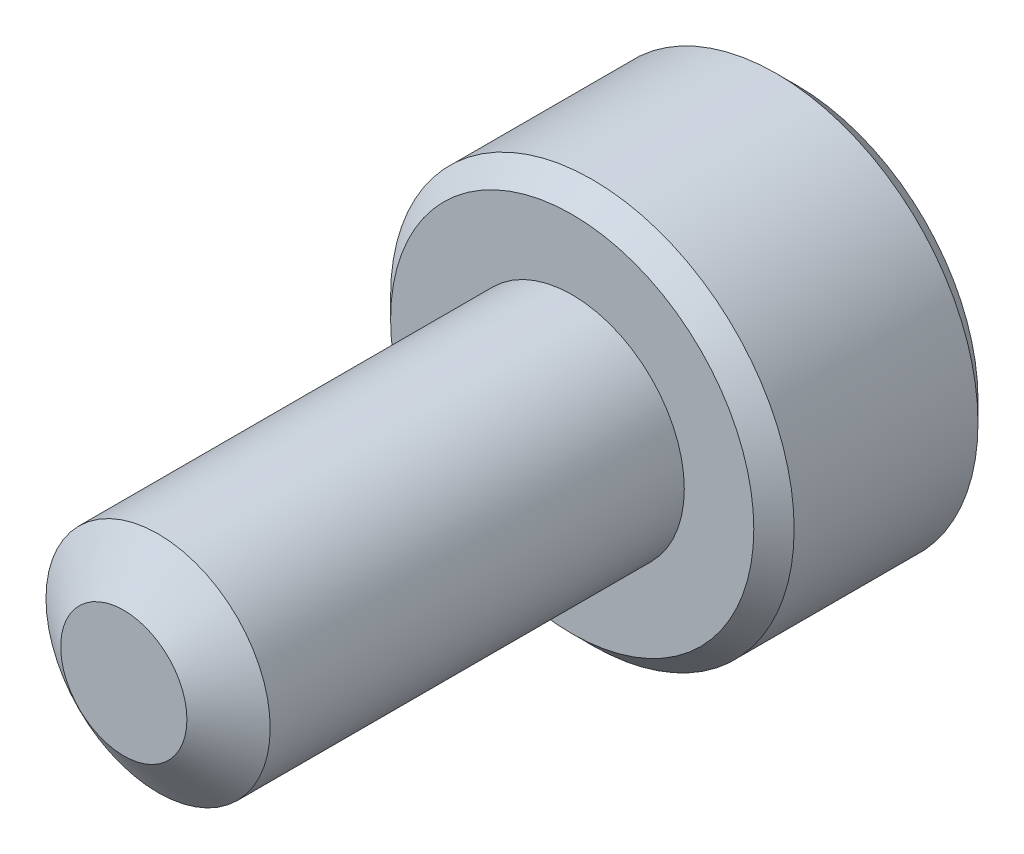
ISO-10303-21;
HEADER;
FILE_DESCRIPTION(('STEP AP214'),'2;1');
FILE_NAME('part.step','',(''),(''),'','','');
FILE_SCHEMA(('AUTOMOTIVE_DESIGN { 1 0 10303 214 1 1 1 1 }'));
ENDSEC;
DATA;
#1=APPLICATION_CONTEXT('core data for automotive mechanical design processes');
#2=APPLICATION_PROTOCOL_DEFINITION('international standard','automotive_design',2000,#1);
#3=PRODUCT_CONTEXT('',#1,'mechanical');
#4=PRODUCT('Part','Part','',(#3));
#5=PRODUCT_RELATED_PRODUCT_CATEGORY('part','',(#4));
#6=PRODUCT_DEFINITION_FORMATION('','',#4);
#7=PRODUCT_DEFINITION_CONTEXT('part definition',#1,'design');
#8=PRODUCT_DEFINITION('design','',#6,#7);
#9=PRODUCT_DEFINITION_SHAPE('','',#8);
#10=(LENGTH_UNIT() NAMED_UNIT(*) SI_UNIT(.MILLI.,.METRE.));
#11=(NAMED_UNIT(*) PLANE_ANGLE_UNIT() SI_UNIT($,.RADIAN.));
#12=(NAMED_UNIT(*) SI_UNIT($,.STERADIAN.) SOLID_ANGLE_UNIT());
#13=UNCERTAINTY_MEASURE_WITH_UNIT(LENGTH_MEASURE(1.E-05),#10,'distance_accuracy_value','');
#14=(GEOMETRIC_REPRESENTATION_CONTEXT(3) GLOBAL_UNCERTAINTY_ASSIGNED_CONTEXT((#13)) GLOBAL_UNIT_ASSIGNED_CONTEXT((#10,
#11,#12)) REPRESENTATION_CONTEXT('',''));
#15=CARTESIAN_POINT('',(0.,0.,0.));
#16=DIRECTION('',(0.,0.,1.));
#17=DIRECTION('',(1.,0.,0.));
#18=AXIS2_PLACEMENT_3D('',#15,#16,#17);
#19=CARTESIAN_POINT('',(0.,0.,-5.));
#20=DIRECTION('',(0.,0.,1.));
#21=DIRECTION('',(1.,0.,0.));
#22=AXIS2_PLACEMENT_3D('',#19,#20,#21);
#23=CYLINDRICAL_SURFACE('',#22,1.25);
#24=CARTESIAN_POINT('',(0.,0.,-5.));
#25=DIRECTION('',(0.,0.,-1.));
#26=DIRECTION('',(-1.,0.,0.));
#27=AXIS2_PLACEMENT_3D('',#24,#25,#26);
#28=CIRCLE('',#27,1.25);
#29=CARTESIAN_POINT('',(-1.25,0.,-5.));
#30=VERTEX_POINT('',#29);
#31=EDGE_CURVE('E119',#30,#30,#28,.F.);
#32=ORIENTED_EDGE('',*,*,#31,.T.);
#33=EDGE_LOOP('',(#32));
#34=FACE_BOUND('',#33,.T.);
#35=CARTESIAN_POINT('',(0.,0.,-0.382511876358968));
#36=DIRECTION('',(0.,0.,1.));
#37=DIRECTION('',(1.,0.,0.));
#38=AXIS2_PLACEMENT_3D('',#35,#36,#37);
#39=CIRCLE('',#38,1.25);
#40=CARTESIAN_POINT('',(1.25,0.,-0.382511876358968));
#41=VERTEX_POINT('',#40);
#42=EDGE_CURVE('E130',#41,#41,#39,.T.);
#43=ORIENTED_EDGE('',*,*,#42,.F.);
#44=EDGE_LOOP('',(#43));
#45=FACE_BOUND('',#44,.T.);
#46=ADVANCED_FACE('F17',(#34,#45),#23,.T.);
#47=CARTESIAN_POINT('',(0.,0.,0.));
#48=DIRECTION('',(0.,0.,-1.));
#49=DIRECTION('',(-1.,0.,0.));
#50=AXIS2_PLACEMENT_3D('',#47,#48,#49);
#51=CONICAL_SURFACE('',#50,0.70371642622275,0.959931088596884);
#52=ORIENTED_EDGE('',*,*,#42,.T.);
#53=EDGE_LOOP('',(#52));
#54=FACE_BOUND('',#53,.T.);
#55=CARTESIAN_POINT('',(0.,0.,0.));
#56=DIRECTION('',(0.,0.,1.));
#57=DIRECTION('',(1.,0.,0.));
#58=AXIS2_PLACEMENT_3D('',#55,#56,#57);
#59=CIRCLE('',#58,0.70371642622275);
#60=CARTESIAN_POINT('',(0.70371642622275,0.,0.));
#61=VERTEX_POINT('',#60);
#62=EDGE_CURVE('E127',#61,#61,#59,.T.);
#63=ORIENTED_EDGE('',*,*,#62,.F.);
#64=EDGE_LOOP('',(#63));
#65=FACE_BOUND('',#64,.T.);
#66=ADVANCED_FACE('F175',(#54,#65),#51,.T.);
#67=CARTESIAN_POINT('',(0.,0.,0.));
#68=DIRECTION('',(0.,0.,1.));
#69=DIRECTION('',(1.,0.,0.));
#70=AXIS2_PLACEMENT_3D('',#67,#68,#69);
#71=PLANE('',#70);
#72=ORIENTED_EDGE('',*,*,#62,.T.);
#73=EDGE_LOOP('',(#72));
#74=FACE_BOUND('',#73,.T.);
#75=ADVANCED_FACE('F182',(#74),#71,.T.);
#76=CARTESIAN_POINT('',(0.,0.,-7.5));
#77=DIRECTION('',(0.,0.,1.));
#78=DIRECTION('',(1.,0.,0.));
#79=AXIS2_PLACEMENT_3D('',#76,#77,#78);
#80=CYLINDRICAL_SURFACE('',#79,2.25);
#81=CARTESIAN_POINT('',(0.,0.,-7.275));
#82=DIRECTION('',(0.,0.,-1.));
#83=DIRECTION('',(-1.,0.,0.));
#84=AXIS2_PLACEMENT_3D('',#81,#82,#83);
#85=CIRCLE('',#84,2.25);
#86=CARTESIAN_POINT('',(-2.25,0.,-7.275));
#87=VERTEX_POINT('',#86);
#88=EDGE_CURVE('E25',#87,#87,#85,.F.);
#89=ORIENTED_EDGE('',*,*,#88,.T.);
#90=EDGE_LOOP('',(#89));
#91=FACE_BOUND('',#90,.T.);
#92=CARTESIAN_POINT('',(0.,0.,-5.225));
#93=DIRECTION('',(0.,0.,-1.));
#94=DIRECTION('',(-1.,0.,0.));
#95=AXIS2_PLACEMENT_3D('',#92,#93,#94);
#96=CIRCLE('',#95,2.25);
#97=CARTESIAN_POINT('',(-2.25,0.,-5.225));
#98=VERTEX_POINT('',#97);
#99=EDGE_CURVE('E136',#98,#98,#96,.T.);
#100=ORIENTED_EDGE('',*,*,#99,.T.);
#101=EDGE_LOOP('',(#100));
#102=FACE_BOUND('',#101,.T.);
#103=ADVANCED_FACE('F141',(#91,#102),#80,.T.);
#104=CARTESIAN_POINT('',(0.,0.,-7.5));
#105=DIRECTION('',(0.,0.,-1.));
#106=DIRECTION('',(-1.,0.,0.));
#107=AXIS2_PLACEMENT_3D('',#104,#105,#106);
#108=PLANE('',#107);
#109=CARTESIAN_POINT('',(0.,0.,-7.5));
#110=DIRECTION('',(0.,0.,-1.));
#111=DIRECTION('',(-1.,0.,0.));
#112=AXIS2_PLACEMENT_3D('',#109,#110,#111);
#113=CIRCLE('',#112,2.025);
#114=CARTESIAN_POINT('',(-2.025,0.,-7.5));
#115=VERTEX_POINT('',#114);
#116=EDGE_CURVE('E133',#115,#115,#113,.T.);
#117=ORIENTED_EDGE('',*,*,#116,.T.);
#118=EDGE_LOOP('',(#117));
#119=FACE_BOUND('',#118,.T.);
#120=DIRECTION('',(0.866025403784439,0.5,0.));
#121=VECTOR('',#120,1.);
#122=CARTESIAN_POINT('',(-1.,0.577350269189626,-7.5));
#123=LINE('',#122,#121);
#124=CARTESIAN_POINT('',(-1.,0.577350269189626,-7.5));
#125=VERTEX_POINT('',#124);
#126=CARTESIAN_POINT('',(0.,1.15470053837925,-7.5));
#127=VERTEX_POINT('',#126);
#128=EDGE_CURVE('E32',#125,#127,#123,.T.);
#129=ORIENTED_EDGE('',*,*,#128,.F.);
#130=DIRECTION('',(0.,1.,0.));
#131=VECTOR('',#130,1.);
#132=CARTESIAN_POINT('',(-1.,-0.577350269189626,-7.5));
#133=LINE('',#132,#131);
#134=CARTESIAN_POINT('',(-1.,-0.577350269189626,-7.5));
#135=VERTEX_POINT('',#134);
#136=EDGE_CURVE('E115',#135,#125,#133,.T.);
#137=ORIENTED_EDGE('',*,*,#136,.F.);
#138=DIRECTION('',(-0.866025403784439,0.5,0.));
#139=VECTOR('',#138,1.);
#140=CARTESIAN_POINT('',(0.,-1.15470053837925,-7.5));
#141=LINE('',#140,#139);
#142=CARTESIAN_POINT('',(0.,-1.15470053837925,-7.5));
#143=VERTEX_POINT('',#142);
#144=EDGE_CURVE('E113',#143,#135,#141,.T.);
#145=ORIENTED_EDGE('',*,*,#144,.F.);
#146=DIRECTION('',(-0.866025403784439,-0.5,0.));
#147=VECTOR('',#146,1.);
#148=CARTESIAN_POINT('',(1.,-0.577350269189626,-7.5));
#149=LINE('',#148,#147);
#150=CARTESIAN_POINT('',(1.,-0.577350269189626,-7.5));
#151=VERTEX_POINT('',#150);
#152=EDGE_CURVE('E80',#151,#143,#149,.T.);
#153=ORIENTED_EDGE('',*,*,#152,.F.);
#154=DIRECTION('',(0.,-1.,0.));
#155=VECTOR('',#154,1.);
#156=CARTESIAN_POINT('',(1.,0.577350269189626,-7.5));
#157=LINE('',#156,#155);
#158=CARTESIAN_POINT('',(1.,0.577350269189626,-7.5));
#159=VERTEX_POINT('',#158);
#160=EDGE_CURVE('E109',#159,#151,#157,.T.);
#161=ORIENTED_EDGE('',*,*,#160,.F.);
#162=DIRECTION('',(0.866025403784439,-0.5,0.));
#163=VECTOR('',#162,1.);
#164=CARTESIAN_POINT('',(0.,1.15470053837925,-7.5));
#165=LINE('',#164,#163);
#166=EDGE_CURVE('E106',#127,#159,#165,.T.);
#167=ORIENTED_EDGE('',*,*,#166,.F.);
#168=EDGE_LOOP('',(#129,#137,#145,#153,#161,#167));
#169=FACE_BOUND('',#168,.T.);
#170=ADVANCED_FACE('F149',(#119,#169),#108,.T.);
#171=CARTESIAN_POINT('',(0.,0.,-5.));
#172=DIRECTION('',(0.,0.,-1.));
#173=DIRECTION('',(-1.,0.,0.));
#174=AXIS2_PLACEMENT_3D('',#171,#172,#173);
#175=PLANE('',#174);
#176=CARTESIAN_POINT('',(0.,0.,-5.));
#177=DIRECTION('',(0.,0.,-1.));
#178=DIRECTION('',(-1.,0.,0.));
#179=AXIS2_PLACEMENT_3D('',#176,#177,#178);
#180=CIRCLE('',#179,2.025);
#181=CARTESIAN_POINT('',(-2.025,0.,-5.));
#182=VERTEX_POINT('',#181);
#183=EDGE_CURVE('E11',#182,#182,#180,.F.);
#184=ORIENTED_EDGE('',*,*,#183,.T.);
#185=EDGE_LOOP('',(#184));
#186=FACE_BOUND('',#185,.T.);
#187=ORIENTED_EDGE('',*,*,#31,.F.);
#188=EDGE_LOOP('',(#187));
#189=FACE_BOUND('',#188,.T.);
#190=ADVANCED_FACE('F152',(#186,#189),#175,.F.);
#191=CARTESIAN_POINT('',(-1.,0.577350269189626,-6.));
#192=DIRECTION('',(-0.5,0.866025403784439,0.));
#193=DIRECTION('',(-0.866025403784439,-0.5,0.));
#194=AXIS2_PLACEMENT_3D('',#191,#192,#193);
#195=PLANE('',#194);
#196=ORIENTED_EDGE('',*,*,#128,.T.);
#197=DIRECTION('',(0.,0.,-1.));
#198=VECTOR('',#197,1.);
#199=CARTESIAN_POINT('',(0.,1.15470053837925,-6.));
#200=LINE('',#199,#198);
#201=CARTESIAN_POINT('',(0.,1.15470053837925,-6.));
#202=VERTEX_POINT('',#201);
#203=EDGE_CURVE('E62',#202,#127,#200,.T.);
#204=ORIENTED_EDGE('',*,*,#203,.F.);
#205=DIRECTION('',(0.866025403784439,0.5,0.));
#206=VECTOR('',#205,1.);
#207=CARTESIAN_POINT('',(-1.,0.577350269189626,-6.));
#208=LINE('',#207,#206);
#209=CARTESIAN_POINT('',(-1.,0.577350269189626,-6.));
#210=VERTEX_POINT('',#209);
#211=EDGE_CURVE('E117',#210,#202,#208,.T.);
#212=ORIENTED_EDGE('',*,*,#211,.F.);
#213=DIRECTION('',(0.,0.,-1.));
#214=VECTOR('',#213,1.);
#215=CARTESIAN_POINT('',(-1.,0.577350269189626,-6.));
#216=LINE('',#215,#214);
#217=EDGE_CURVE('E40',#210,#125,#216,.T.);
#218=ORIENTED_EDGE('',*,*,#217,.T.);
#219=EDGE_LOOP('',(#196,#204,#212,#218));
#220=FACE_BOUND('',#219,.T.);
#221=ADVANCED_FACE('F160',(#220),#195,.F.);
#222=CARTESIAN_POINT('',(-1.,-0.577350269189626,-6.));
#223=DIRECTION('',(-1.,0.,0.));
#224=DIRECTION('',(0.,-1.,0.));
#225=AXIS2_PLACEMENT_3D('',#222,#223,#224);
#226=PLANE('',#225);
#227=ORIENTED_EDGE('',*,*,#136,.T.);
#228=ORIENTED_EDGE('',*,*,#217,.F.);
#229=DIRECTION('',(0.,1.,0.));
#230=VECTOR('',#229,1.);
#231=CARTESIAN_POINT('',(-1.,-0.577350269189626,-6.));
#232=LINE('',#231,#230);
#233=CARTESIAN_POINT('',(-1.,-0.577350269189626,-6.));
#234=VERTEX_POINT('',#233);
#235=EDGE_CURVE('E92',#234,#210,#232,.T.);
#236=ORIENTED_EDGE('',*,*,#235,.F.);
#237=DIRECTION('',(0.,0.,-1.));
#238=VECTOR('',#237,1.);
#239=CARTESIAN_POINT('',(-1.,-0.577350269189626,-6.));
#240=LINE('',#239,#238);
#241=EDGE_CURVE('E84',#234,#135,#240,.T.);
#242=ORIENTED_EDGE('',*,*,#241,.T.);
#243=EDGE_LOOP('',(#227,#228,#236,#242));
#244=FACE_BOUND('',#243,.T.);
#245=ADVANCED_FACE('F162',(#244),#226,.F.);
#246=CARTESIAN_POINT('',(0.,-1.15470053837925,-6.));
#247=DIRECTION('',(-0.5,-0.866025403784439,0.));
#248=DIRECTION('',(0.866025403784439,-0.5,0.));
#249=AXIS2_PLACEMENT_3D('',#246,#247,#248);
#250=PLANE('',#249);
#251=ORIENTED_EDGE('',*,*,#144,.T.);
#252=ORIENTED_EDGE('',*,*,#241,.F.);
#253=DIRECTION('',(-0.866025403784439,0.5,0.));
#254=VECTOR('',#253,1.);
#255=CARTESIAN_POINT('',(0.,-1.15470053837925,-6.));
#256=LINE('',#255,#254);
#257=CARTESIAN_POINT('',(0.,-1.15470053837925,-6.));
#258=VERTEX_POINT('',#257);
#259=EDGE_CURVE('E88',#258,#234,#256,.T.);
#260=ORIENTED_EDGE('',*,*,#259,.F.);
#261=DIRECTION('',(0.,0.,-1.));
#262=VECTOR('',#261,1.);
#263=CARTESIAN_POINT('',(0.,-1.15470053837925,-6.));
#264=LINE('',#263,#262);
#265=EDGE_CURVE('E73',#258,#143,#264,.T.);
#266=ORIENTED_EDGE('',*,*,#265,.T.);
#267=EDGE_LOOP('',(#251,#252,#260,#266));
#268=FACE_BOUND('',#267,.T.);
#269=ADVANCED_FACE('F89',(#268),#250,.F.);
#270=CARTESIAN_POINT('',(1.,-0.577350269189626,-6.));
#271=DIRECTION('',(0.5,-0.866025403784439,0.));
#272=DIRECTION('',(0.866025403784439,0.5,0.));
#273=AXIS2_PLACEMENT_3D('',#270,#271,#272);
#274=PLANE('',#273);
#275=ORIENTED_EDGE('',*,*,#152,.T.);
#276=ORIENTED_EDGE('',*,*,#265,.F.);
#277=DIRECTION('',(-0.866025403784439,-0.5,0.));
#278=VECTOR('',#277,1.);
#279=CARTESIAN_POINT('',(1.,-0.577350269189626,-6.));
#280=LINE('',#279,#278);
#281=CARTESIAN_POINT('',(1.,-0.577350269189626,-6.));
#282=VERTEX_POINT('',#281);
#283=EDGE_CURVE('E77',#282,#258,#280,.T.);
#284=ORIENTED_EDGE('',*,*,#283,.F.);
#285=DIRECTION('',(0.,0.,-1.));
#286=VECTOR('',#285,1.);
#287=CARTESIAN_POINT('',(1.,-0.577350269189626,-6.));
#288=LINE('',#287,#286);
#289=EDGE_CURVE('E85',#282,#151,#288,.T.);
#290=ORIENTED_EDGE('',*,*,#289,.T.);
#291=EDGE_LOOP('',(#275,#276,#284,#290));
#292=FACE_BOUND('',#291,.T.);
#293=ADVANCED_FACE('F75',(#292),#274,.F.);
#294=CARTESIAN_POINT('',(1.,0.577350269189626,-6.));
#295=DIRECTION('',(1.,0.,0.));
#296=DIRECTION('',(0.,0.,-1.));
#297=AXIS2_PLACEMENT_3D('',#294,#295,#296);
#298=PLANE('',#297);
#299=ORIENTED_EDGE('',*,*,#160,.T.);
#300=ORIENTED_EDGE('',*,*,#289,.F.);
#301=DIRECTION('',(0.,-1.,0.));
#302=VECTOR('',#301,1.);
#303=CARTESIAN_POINT('',(1.,0.577350269189626,-6.));
#304=LINE('',#303,#302);
#305=CARTESIAN_POINT('',(1.,0.577350269189626,-6.));
#306=VERTEX_POINT('',#305);
#307=EDGE_CURVE('E98',#306,#282,#304,.T.);
#308=ORIENTED_EDGE('',*,*,#307,.F.);
#309=DIRECTION('',(0.,0.,-1.));
#310=VECTOR('',#309,1.);
#311=CARTESIAN_POINT('',(1.,0.577350269189626,-6.));
#312=LINE('',#311,#310);
#313=EDGE_CURVE('E122',#306,#159,#312,.T.);
#314=ORIENTED_EDGE('',*,*,#313,.T.);
#315=EDGE_LOOP('',(#299,#300,#308,#314));
#316=FACE_BOUND('',#315,.T.);
#317=ADVANCED_FACE('F238',(#316),#298,.F.);
#318=CARTESIAN_POINT('',(0.,1.15470053837925,-6.));
#319=DIRECTION('',(0.5,0.866025403784439,0.));
#320=DIRECTION('',(-0.866025403784439,0.5,0.));
#321=AXIS2_PLACEMENT_3D('',#318,#319,#320);
#322=PLANE('',#321);
#323=ORIENTED_EDGE('',*,*,#166,.T.);
#324=ORIENTED_EDGE('',*,*,#313,.F.);
#325=DIRECTION('',(0.866025403784439,-0.5,0.));
#326=VECTOR('',#325,1.);
#327=CARTESIAN_POINT('',(0.,1.15470053837925,-6.));
#328=LINE('',#327,#326);
#329=EDGE_CURVE('E100',#202,#306,#328,.T.);
#330=ORIENTED_EDGE('',*,*,#329,.F.);
#331=ORIENTED_EDGE('',*,*,#203,.T.);
#332=EDGE_LOOP('',(#323,#324,#330,#331));
#333=FACE_BOUND('',#332,.T.);
#334=ADVANCED_FACE('F158',(#333),#322,.F.);
#335=CARTESIAN_POINT('',(1.,1.73205080756887,-6.));
#336=DIRECTION('',(0.,0.,-1.));
#337=DIRECTION('',(-1.,0.,0.));
#338=AXIS2_PLACEMENT_3D('',#335,#336,#337);
#339=PLANE('',#338);
#340=ORIENTED_EDGE('',*,*,#211,.T.);
#341=ORIENTED_EDGE('',*,*,#329,.T.);
#342=ORIENTED_EDGE('',*,*,#307,.T.);
#343=ORIENTED_EDGE('',*,*,#283,.T.);
#344=ORIENTED_EDGE('',*,*,#259,.T.);
#345=ORIENTED_EDGE('',*,*,#235,.T.);
#346=EDGE_LOOP('',(#340,#341,#342,#343,#344,#345));
#347=FACE_BOUND('',#346,.T.);
#348=ADVANCED_FACE('F95',(#347),#339,.T.);
#349=CARTESIAN_POINT('',(0.,0.,-7.5));
#350=DIRECTION('',(0.,0.,1.));
#351=DIRECTION('',(1.,0.,0.));
#352=AXIS2_PLACEMENT_3D('',#349,#350,#351);
#353=CONICAL_SURFACE('',#352,2.025,0.785398163397443);
#354=ORIENTED_EDGE('',*,*,#88,.F.);
#355=EDGE_LOOP('',(#354));
#356=FACE_BOUND('',#355,.T.);
#357=ORIENTED_EDGE('',*,*,#116,.F.);
#358=EDGE_LOOP('',(#357));
#359=FACE_BOUND('',#358,.T.);
#360=ADVANCED_FACE('F144',(#356,#359),#353,.T.);
#361=CARTESIAN_POINT('',(0.,0.,-5.225));
#362=DIRECTION('',(0.,0.,-1.));
#363=DIRECTION('',(-1.,0.,0.));
#364=AXIS2_PLACEMENT_3D('',#361,#362,#363);
#365=CONICAL_SURFACE('',#364,2.25,0.785398163397451);
#366=ORIENTED_EDGE('',*,*,#183,.F.);
#367=EDGE_LOOP('',(#366));
#368=FACE_BOUND('',#367,.T.);
#369=ORIENTED_EDGE('',*,*,#99,.F.);
#370=EDGE_LOOP('',(#369));
#371=FACE_BOUND('',#370,.T.);
#372=ADVANCED_FACE('F19',(#368,#371),#365,.T.);
#373=CLOSED_SHELL('',(#46,#66,#75,#103,#170,#190,#221,#245,#269,#293,#317,#334,#348,#360,#372));
#374=MANIFOLD_SOLID_BREP('B1',#373);
#375=ADVANCED_BREP_SHAPE_REPRESENTATION('',(#18,#374),#14);
#376=SHAPE_DEFINITION_REPRESENTATION(#9,#375);
ENDSEC;
END-ISO-10303-21;
